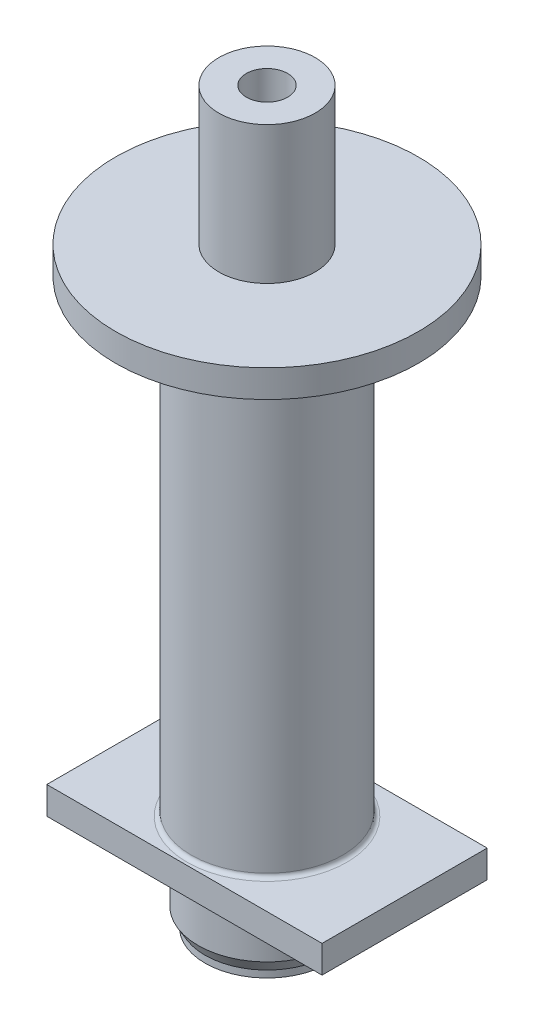
ISO-10303-21;
HEADER;
FILE_DESCRIPTION(('STEP AP214'),'2;1');
FILE_NAME('part.step','',(''),(''),'','','');
FILE_SCHEMA(('AUTOMOTIVE_DESIGN { 1 0 10303 214 1 1 1 1 }'));
ENDSEC;
DATA;
#1=APPLICATION_CONTEXT('core data for automotive mechanical design processes');
#2=APPLICATION_PROTOCOL_DEFINITION('international standard','automotive_design',2000,#1);
#3=PRODUCT_CONTEXT('',#1,'mechanical');
#4=PRODUCT('Part','Part','',(#3));
#5=PRODUCT_RELATED_PRODUCT_CATEGORY('part','',(#4));
#6=PRODUCT_DEFINITION_FORMATION('','',#4);
#7=PRODUCT_DEFINITION_CONTEXT('part definition',#1,'design');
#8=PRODUCT_DEFINITION('design','',#6,#7);
#9=PRODUCT_DEFINITION_SHAPE('','',#8);
#10=(LENGTH_UNIT() NAMED_UNIT(*) SI_UNIT(.MILLI.,.METRE.));
#11=(NAMED_UNIT(*) PLANE_ANGLE_UNIT() SI_UNIT($,.RADIAN.));
#12=(NAMED_UNIT(*) SI_UNIT($,.STERADIAN.) SOLID_ANGLE_UNIT());
#13=UNCERTAINTY_MEASURE_WITH_UNIT(LENGTH_MEASURE(1.E-05),#10,'distance_accuracy_value','');
#14=(GEOMETRIC_REPRESENTATION_CONTEXT(3) GLOBAL_UNCERTAINTY_ASSIGNED_CONTEXT((#13)) GLOBAL_UNIT_ASSIGNED_CONTEXT((#10,
#11,#12)) REPRESENTATION_CONTEXT('',''));
#15=CARTESIAN_POINT('',(0.,0.,0.));
#16=DIRECTION('',(0.,0.,1.));
#17=DIRECTION('',(1.,0.,0.));
#18=AXIS2_PLACEMENT_3D('',#15,#16,#17);
#19=CARTESIAN_POINT('',(-34.9999999999999,530.,0.));
#20=DIRECTION('',(0.,1.,0.));
#21=DIRECTION('',(0.,0.,1.));
#22=AXIS2_PLACEMENT_3D('',#19,#20,#21);
#23=PLANE('',#22);
#24=CARTESIAN_POINT('',(0.,530.,0.));
#25=DIRECTION('',(0.,1.,0.));
#26=DIRECTION('',(-1.,0.,0.));
#27=AXIS2_PLACEMENT_3D('',#24,#25,#26);
#28=CIRCLE('',#27,15.);
#29=CARTESIAN_POINT('',(-15.,530.,0.));
#30=VERTEX_POINT('',#29);
#31=EDGE_CURVE('E104',#30,#30,#28,.T.);
#32=ORIENTED_EDGE('',*,*,#31,.F.);
#33=EDGE_LOOP('',(#32));
#34=FACE_BOUND('',#33,.T.);
#35=CARTESIAN_POINT('',(0.,530.,0.));
#36=DIRECTION('',(0.,1.,0.));
#37=DIRECTION('',(0.,0.,1.));
#38=AXIS2_PLACEMENT_3D('',#35,#36,#37);
#39=CIRCLE('',#38,34.9999999999999);
#40=CARTESIAN_POINT('',(0.,530.,34.9999999999999));
#41=VERTEX_POINT('',#40);
#42=EDGE_CURVE('E141',#41,#41,#39,.T.);
#43=ORIENTED_EDGE('',*,*,#42,.T.);
#44=EDGE_LOOP('',(#43));
#45=FACE_BOUND('',#44,.T.);
#46=ADVANCED_FACE('F33',(#34,#45),#23,.T.);
#47=CARTESIAN_POINT('',(0.,530.,0.));
#48=DIRECTION('',(0.,1.,0.));
#49=DIRECTION('',(0.,0.,1.));
#50=AXIS2_PLACEMENT_3D('',#47,#48,#49);
#51=CYLINDRICAL_SURFACE('',#50,34.9999999999999);
#52=CARTESIAN_POINT('',(0.,430.,0.));
#53=DIRECTION('',(0.,1.,0.));
#54=DIRECTION('',(0.,0.,1.));
#55=AXIS2_PLACEMENT_3D('',#52,#53,#54);
#56=CIRCLE('',#55,34.9999999999999);
#57=CARTESIAN_POINT('',(0.,430.,34.9999999999999));
#58=VERTEX_POINT('',#57);
#59=EDGE_CURVE('E138',#58,#58,#56,.T.);
#60=ORIENTED_EDGE('',*,*,#59,.T.);
#61=EDGE_LOOP('',(#60));
#62=FACE_BOUND('',#61,.T.);
#63=ORIENTED_EDGE('',*,*,#42,.F.);
#64=EDGE_LOOP('',(#63));
#65=FACE_BOUND('',#64,.T.);
#66=ADVANCED_FACE('F177',(#62,#65),#51,.T.);
#67=CARTESIAN_POINT('',(-110.,430.,0.));
#68=DIRECTION('',(0.,1.,0.));
#69=DIRECTION('',(0.,0.,1.));
#70=AXIS2_PLACEMENT_3D('',#67,#68,#69);
#71=PLANE('',#70);
#72=CARTESIAN_POINT('',(0.,430.,0.));
#73=DIRECTION('',(0.,1.,0.));
#74=DIRECTION('',(0.,0.,1.));
#75=AXIS2_PLACEMENT_3D('',#72,#73,#74);
#76=CIRCLE('',#75,110.);
#77=CARTESIAN_POINT('',(0.,430.,110.));
#78=VERTEX_POINT('',#77);
#79=EDGE_CURVE('E135',#78,#78,#76,.T.);
#80=ORIENTED_EDGE('',*,*,#79,.T.);
#81=EDGE_LOOP('',(#80));
#82=FACE_BOUND('',#81,.T.);
#83=ORIENTED_EDGE('',*,*,#59,.F.);
#84=EDGE_LOOP('',(#83));
#85=FACE_BOUND('',#84,.T.);
#86=ADVANCED_FACE('F182',(#82,#85),#71,.T.);
#87=CARTESIAN_POINT('',(0.,530.,0.));
#88=DIRECTION('',(0.,1.,0.));
#89=DIRECTION('',(0.,0.,1.));
#90=AXIS2_PLACEMENT_3D('',#87,#88,#89);
#91=CYLINDRICAL_SURFACE('',#90,110.);
#92=CARTESIAN_POINT('',(0.,410.,0.));
#93=DIRECTION('',(0.,1.,0.));
#94=DIRECTION('',(0.,0.,1.));
#95=AXIS2_PLACEMENT_3D('',#92,#93,#94);
#96=CIRCLE('',#95,110.);
#97=CARTESIAN_POINT('',(0.,410.,110.));
#98=VERTEX_POINT('',#97);
#99=EDGE_CURVE('E132',#98,#98,#96,.T.);
#100=ORIENTED_EDGE('',*,*,#99,.T.);
#101=EDGE_LOOP('',(#100));
#102=FACE_BOUND('',#101,.T.);
#103=ORIENTED_EDGE('',*,*,#79,.F.);
#104=EDGE_LOOP('',(#103));
#105=FACE_BOUND('',#104,.T.);
#106=ADVANCED_FACE('F190',(#102,#105),#91,.T.);
#107=CARTESIAN_POINT('',(-54.9999999999999,410.,0.));
#108=DIRECTION('',(0.,-1.,0.));
#109=DIRECTION('',(0.,0.,-1.));
#110=AXIS2_PLACEMENT_3D('',#107,#108,#109);
#111=PLANE('',#110);
#112=CARTESIAN_POINT('',(0.,410.,0.));
#113=DIRECTION('',(0.,1.,0.));
#114=DIRECTION('',(0.,0.,1.));
#115=AXIS2_PLACEMENT_3D('',#112,#113,#114);
#116=CIRCLE('',#115,54.9999999999999);
#117=CARTESIAN_POINT('',(0.,410.,54.9999999999999));
#118=VERTEX_POINT('',#117);
#119=EDGE_CURVE('E129',#118,#118,#116,.T.);
#120=ORIENTED_EDGE('',*,*,#119,.T.);
#121=EDGE_LOOP('',(#120));
#122=FACE_BOUND('',#121,.T.);
#123=ORIENTED_EDGE('',*,*,#99,.F.);
#124=EDGE_LOOP('',(#123));
#125=FACE_BOUND('',#124,.T.);
#126=ADVANCED_FACE('F194',(#122,#125),#111,.T.);
#127=CARTESIAN_POINT('',(0.,530.,0.));
#128=DIRECTION('',(0.,1.,0.));
#129=DIRECTION('',(0.,0.,1.));
#130=AXIS2_PLACEMENT_3D('',#127,#128,#129);
#131=CYLINDRICAL_SURFACE('',#130,55.);
#132=CARTESIAN_POINT('',(0.,73.,0.));
#133=DIRECTION('',(0.,1.,0.));
#134=DIRECTION('',(0.,0.,1.));
#135=AXIS2_PLACEMENT_3D('',#132,#133,#134);
#136=CIRCLE('',#135,55.);
#137=CARTESIAN_POINT('',(0.,73.,55.));
#138=VERTEX_POINT('',#137);
#139=EDGE_CURVE('E144',#138,#138,#136,.T.);
#140=ORIENTED_EDGE('',*,*,#139,.T.);
#141=EDGE_LOOP('',(#140));
#142=FACE_BOUND('',#141,.T.);
#143=ORIENTED_EDGE('',*,*,#119,.F.);
#144=EDGE_LOOP('',(#143));
#145=FACE_BOUND('',#144,.T.);
#146=ADVANCED_FACE('F198',(#142,#145),#131,.T.);
#147=CARTESIAN_POINT('',(-60.,70.,0.));
#148=DIRECTION('',(0.,1.,0.));
#149=DIRECTION('',(0.,0.,1.));
#150=AXIS2_PLACEMENT_3D('',#147,#148,#149);
#151=PLANE('',#150);
#152=CARTESIAN_POINT('',(0.,70.,0.));
#153=DIRECTION('',(0.,1.,0.));
#154=DIRECTION('',(0.,0.,1.));
#155=AXIS2_PLACEMENT_3D('',#152,#153,#154);
#156=CIRCLE('',#155,58.);
#157=CARTESIAN_POINT('',(0.,70.,58.));
#158=VERTEX_POINT('',#157);
#159=EDGE_CURVE('E43',#158,#158,#156,.F.);
#160=ORIENTED_EDGE('',*,*,#159,.T.);
#161=EDGE_LOOP('',(#160));
#162=FACE_BOUND('',#161,.T.);
#163=DIRECTION('',(0.,0.,-1.));
#164=VECTOR('',#163,1.);
#165=CARTESIAN_POINT('',(100.,70.,60.));
#166=LINE('',#165,#164);
#167=CARTESIAN_POINT('',(100.,70.,60.));
#168=VERTEX_POINT('',#167);
#169=CARTESIAN_POINT('',(100.,70.,-60.));
#170=VERTEX_POINT('',#169);
#171=EDGE_CURVE('E87',#168,#170,#166,.T.);
#172=ORIENTED_EDGE('',*,*,#171,.T.);
#173=DIRECTION('',(-1.,0.,0.));
#174=VECTOR('',#173,1.);
#175=CARTESIAN_POINT('',(100.,70.,-60.));
#176=LINE('',#175,#174);
#177=CARTESIAN_POINT('',(-100.,70.,-59.9999999999999));
#178=VERTEX_POINT('',#177);
#179=EDGE_CURVE('E82',#170,#178,#176,.T.);
#180=ORIENTED_EDGE('',*,*,#179,.T.);
#181=DIRECTION('',(0.,0.,1.));
#182=VECTOR('',#181,1.);
#183=CARTESIAN_POINT('',(-100.,70.,-59.9999999999999));
#184=LINE('',#183,#182);
#185=CARTESIAN_POINT('',(-100.,70.,60.));
#186=VERTEX_POINT('',#185);
#187=EDGE_CURVE('E51',#178,#186,#184,.T.);
#188=ORIENTED_EDGE('',*,*,#187,.T.);
#189=DIRECTION('',(1.,0.,0.));
#190=VECTOR('',#189,1.);
#191=CARTESIAN_POINT('',(-100.,70.,60.));
#192=LINE('',#191,#190);
#193=EDGE_CURVE('E79',#186,#168,#192,.T.);
#194=ORIENTED_EDGE('',*,*,#193,.T.);
#195=EDGE_LOOP('',(#172,#180,#188,#194));
#196=FACE_BOUND('',#195,.T.);
#197=ADVANCED_FACE('F90',(#162,#196),#151,.T.);
#198=CARTESIAN_POINT('',(0.,73.,0.));
#199=DIRECTION('',(0.,1.,0.));
#200=DIRECTION('',(0.,0.,1.));
#201=AXIS2_PLACEMENT_3D('',#198,#199,#200);
#202=TOROIDAL_SURFACE('',#201,58.,3.);
#203=ORIENTED_EDGE('',*,*,#159,.F.);
#204=EDGE_LOOP('',(#203));
#205=FACE_BOUND('',#204,.T.);
#206=ORIENTED_EDGE('',*,*,#139,.F.);
#207=EDGE_LOOP('',(#206));
#208=FACE_BOUND('',#207,.T.);
#209=ADVANCED_FACE('F35',(#205,#208),#202,.F.);
#210=CARTESIAN_POINT('',(0.,410.,0.));
#211=DIRECTION('',(0.,-1.,0.));
#212=DIRECTION('',(0.,0.,-1.));
#213=AXIS2_PLACEMENT_3D('',#210,#211,#212);
#214=CYLINDRICAL_SURFACE('',#213,25.);
#215=CARTESIAN_POINT('',(0.,70.,0.));
#216=DIRECTION('',(0.,1.,0.));
#217=DIRECTION('',(0.,0.,1.));
#218=AXIS2_PLACEMENT_3D('',#215,#216,#217);
#219=CIRCLE('',#218,25.);
#220=CARTESIAN_POINT('',(0.,70.,-25.));
#221=VERTEX_POINT('',#220);
#222=EDGE_CURVE('E37',#221,#221,#219,.F.);
#223=CARTESIAN_POINT('',(0.,410.,0.));
#224=DIRECTION('',(0.,-1.,0.));
#225=DIRECTION('',(0.,0.,-1.));
#226=AXIS2_PLACEMENT_3D('',#223,#224,#225);
#227=CIRCLE('',#226,25.);
#228=CARTESIAN_POINT('',(0.,410.,-25.));
#229=VERTEX_POINT('',#228);
#230=EDGE_CURVE('E108',#229,#229,#227,.T.);
#231=CARTESIAN_POINT('',(0.,70.,-25.));
#232=CARTESIAN_POINT('',(0.,73.5416666666666,-25.));
#233=CARTESIAN_POINT('',(0.,77.0833333333333,-25.));
#234=CARTESIAN_POINT('',(0.,84.1666666666666,-25.));
#235=CARTESIAN_POINT('',(0.,87.7083333333333,-25.));
#236=CARTESIAN_POINT('',(0.,94.7916666666666,-25.));
#237=CARTESIAN_POINT('',(0.,98.3333333333333,-25.));
#238=CARTESIAN_POINT('',(0.,105.416666666667,-25.));
#239=CARTESIAN_POINT('',(0.,108.958333333333,-25.));
#240=CARTESIAN_POINT('',(0.,116.041666666667,-25.));
#241=CARTESIAN_POINT('',(0.,119.583333333333,-25.));
#242=CARTESIAN_POINT('',(0.,126.666666666667,-25.));
#243=CARTESIAN_POINT('',(0.,130.208333333333,-25.));
#244=CARTESIAN_POINT('',(0.,137.291666666667,-25.));
#245=CARTESIAN_POINT('',(0.,140.833333333333,-25.));
#246=CARTESIAN_POINT('',(0.,147.916666666667,-25.));
#247=CARTESIAN_POINT('',(0.,151.458333333333,-25.));
#248=CARTESIAN_POINT('',(0.,158.541666666667,-25.));
#249=CARTESIAN_POINT('',(0.,162.083333333333,-25.));
#250=CARTESIAN_POINT('',(0.,169.166666666667,-25.));
#251=CARTESIAN_POINT('',(0.,172.708333333333,-25.));
#252=CARTESIAN_POINT('',(0.,179.791666666667,-25.));
#253=CARTESIAN_POINT('',(0.,183.333333333333,-25.));
#254=CARTESIAN_POINT('',(0.,190.416666666667,-25.));
#255=CARTESIAN_POINT('',(0.,193.958333333333,-25.));
#256=CARTESIAN_POINT('',(0.,201.041666666667,-25.));
#257=CARTESIAN_POINT('',(0.,204.583333333333,-25.));
#258=CARTESIAN_POINT('',(0.,211.666666666667,-25.));
#259=CARTESIAN_POINT('',(0.,215.208333333333,-25.));
#260=CARTESIAN_POINT('',(0.,222.291666666667,-25.));
#261=CARTESIAN_POINT('',(0.,225.833333333333,-25.));
#262=CARTESIAN_POINT('',(0.,232.916666666667,-25.));
#263=CARTESIAN_POINT('',(0.,236.458333333333,-25.));
#264=CARTESIAN_POINT('',(0.,243.541666666667,-25.));
#265=CARTESIAN_POINT('',(0.,247.083333333333,-25.));
#266=CARTESIAN_POINT('',(0.,254.166666666667,-25.));
#267=CARTESIAN_POINT('',(0.,257.708333333333,-25.));
#268=CARTESIAN_POINT('',(0.,264.791666666667,-25.));
#269=CARTESIAN_POINT('',(0.,268.333333333333,-25.));
#270=CARTESIAN_POINT('',(0.,275.416666666667,-25.));
#271=CARTESIAN_POINT('',(0.,278.958333333333,-25.));
#272=CARTESIAN_POINT('',(0.,286.041666666667,-25.));
#273=CARTESIAN_POINT('',(0.,289.583333333333,-25.));
#274=CARTESIAN_POINT('',(0.,296.666666666667,-25.));
#275=CARTESIAN_POINT('',(0.,300.208333333333,-25.));
#276=CARTESIAN_POINT('',(0.,307.291666666667,-25.));
#277=CARTESIAN_POINT('',(0.,310.833333333333,-25.));
#278=CARTESIAN_POINT('',(0.,317.916666666667,-25.));
#279=CARTESIAN_POINT('',(0.,321.458333333333,-25.));
#280=CARTESIAN_POINT('',(0.,328.541666666667,-25.));
#281=CARTESIAN_POINT('',(0.,332.083333333333,-25.));
#282=CARTESIAN_POINT('',(0.,339.166666666667,-25.));
#283=CARTESIAN_POINT('',(0.,342.708333333333,-25.));
#284=CARTESIAN_POINT('',(0.,349.791666666667,-25.));
#285=CARTESIAN_POINT('',(0.,353.333333333333,-25.));
#286=CARTESIAN_POINT('',(0.,360.416666666667,-25.));
#287=CARTESIAN_POINT('',(0.,363.958333333333,-25.));
#288=CARTESIAN_POINT('',(0.,371.041666666667,-25.));
#289=CARTESIAN_POINT('',(0.,374.583333333333,-25.));
#290=CARTESIAN_POINT('',(0.,381.666666666667,-25.));
#291=CARTESIAN_POINT('',(0.,385.208333333333,-25.));
#292=CARTESIAN_POINT('',(0.,392.291666666667,-25.));
#293=CARTESIAN_POINT('',(0.,395.833333333333,-25.));
#294=CARTESIAN_POINT('',(0.,402.916666666667,-25.));
#295=CARTESIAN_POINT('',(0.,406.458333333333,-25.));
#296=CARTESIAN_POINT('',(0.,410.,-25.));
#297=B_SPLINE_CURVE_WITH_KNOTS('',3,(#231,#232,#233,#234,#235,#236,#237,#238,#239,#240,#241,
#242,#243,#244,#245,#246,#247,#248,#249,#250,#251,#252,#253,#254,#255,#256,#257,#258,#259,#260,
#261,#262,#263,#264,#265,#266,#267,#268,#269,#270,#271,#272,#273,#274,#275,#276,#277,#278,#279,
#280,#281,#282,#283,#284,#285,#286,#287,#288,#289,#290,#291,#292,#293,#294,#295,#296),
.UNSPECIFIED.,.F.,.F.,(4,2,2,2,2,2,2,2,2,2,2,2,2,2,2,2,2,2,2,2,2,2,2,2,2,2,2,2,2,2,2,2,4),(0.,
10.625,21.25,31.875,42.5,53.125,63.75,74.375,85.,95.625,106.25,116.875,127.5,138.125,148.75,
159.375,170.,180.625,191.25,201.875,212.5,223.125,233.75,244.375,255.,265.625,276.25,286.875,
297.5,308.125,318.75,329.375,340.),.UNSPECIFIED.);
#298=EDGE_CURVE('BSEAM158',#221,#229,#297,.T.);
#299=ORIENTED_EDGE('',*,*,#222,.T.);
#300=ORIENTED_EDGE('',*,*,#230,.F.);
#301=ORIENTED_EDGE('',*,*,#298,.T.);
#302=ORIENTED_EDGE('',*,*,#298,.F.);
#303=EDGE_LOOP('',(#299,#301,#300,#302));
#304=FACE_BOUND('',#303,.T.);
#305=ADVANCED_FACE('F158',(#304),#214,.F.);
#306=CARTESIAN_POINT('',(0.,410.,0.));
#307=DIRECTION('',(0.,-1.,0.));
#308=DIRECTION('',(0.,0.,-1.));
#309=AXIS2_PLACEMENT_3D('',#306,#307,#308);
#310=PLANE('',#309);
#311=CARTESIAN_POINT('',(0.,410.,0.));
#312=DIRECTION('',(0.,-1.,0.));
#313=DIRECTION('',(0.,0.,-1.));
#314=AXIS2_PLACEMENT_3D('',#311,#312,#313);
#315=CIRCLE('',#314,15.);
#316=CARTESIAN_POINT('',(0.,410.,-15.));
#317=VERTEX_POINT('',#316);
#318=EDGE_CURVE('E107',#317,#317,#315,.T.);
#319=ORIENTED_EDGE('',*,*,#318,.F.);
#320=EDGE_LOOP('',(#319));
#321=FACE_BOUND('',#320,.T.);
#322=ORIENTED_EDGE('',*,*,#230,.T.);
#323=EDGE_LOOP('',(#322));
#324=FACE_BOUND('',#323,.T.);
#325=ADVANCED_FACE('F155',(#321,#324),#310,.T.);
#326=CARTESIAN_POINT('',(0.,380.,0.));
#327=DIRECTION('',(0.,1.,0.));
#328=DIRECTION('',(-1.,0.,0.));
#329=AXIS2_PLACEMENT_3D('',#326,#327,#328);
#330=CYLINDRICAL_SURFACE('',#329,15.);
#331=ORIENTED_EDGE('',*,*,#318,.T.);
#332=EDGE_LOOP('',(#331));
#333=FACE_BOUND('',#332,.T.);
#334=ORIENTED_EDGE('',*,*,#31,.T.);
#335=EDGE_LOOP('',(#334));
#336=FACE_BOUND('',#335,.T.);
#337=ADVANCED_FACE('F152',(#333,#336),#330,.F.);
#338=CARTESIAN_POINT('',(0.,70.,0.));
#339=DIRECTION('',(0.,1.,0.));
#340=DIRECTION('',(0.,0.,1.));
#341=AXIS2_PLACEMENT_3D('',#338,#339,#340);
#342=PLANE('',#341);
#343=ORIENTED_EDGE('',*,*,#222,.F.);
#344=EDGE_LOOP('',(#343));
#345=FACE_BOUND('',#344,.T.);
#346=ADVANCED_FACE('F250',(#345),#342,.T.);
#347=CARTESIAN_POINT('',(0.,70.,60.));
#348=DIRECTION('',(0.,0.,-1.));
#349=DIRECTION('',(-1.,0.,0.));
#350=AXIS2_PLACEMENT_3D('',#347,#348,#349);
#351=PLANE('',#350);
#352=DIRECTION('',(0.,-1.,0.));
#353=VECTOR('',#352,1.);
#354=CARTESIAN_POINT('',(100.,70.,60.));
#355=LINE('',#354,#353);
#356=CARTESIAN_POINT('',(100.,50.,60.));
#357=VERTEX_POINT('',#356);
#358=EDGE_CURVE('E97',#168,#357,#355,.T.);
#359=ORIENTED_EDGE('',*,*,#358,.F.);
#360=ORIENTED_EDGE('',*,*,#193,.F.);
#361=DIRECTION('',(0.,-1.,0.));
#362=VECTOR('',#361,1.);
#363=CARTESIAN_POINT('',(-100.,70.,60.));
#364=LINE('',#363,#362);
#365=CARTESIAN_POINT('',(-100.,50.,60.));
#366=VERTEX_POINT('',#365);
#367=EDGE_CURVE('E100',#186,#366,#364,.T.);
#368=ORIENTED_EDGE('',*,*,#367,.T.);
#369=DIRECTION('',(1.,0.,0.));
#370=VECTOR('',#369,1.);
#371=CARTESIAN_POINT('',(0.,50.,60.));
#372=LINE('',#371,#370);
#373=EDGE_CURVE('E74',#366,#357,#372,.T.);
#374=ORIENTED_EDGE('',*,*,#373,.T.);
#375=EDGE_LOOP('',(#359,#360,#368,#374));
#376=FACE_BOUND('',#375,.T.);
#377=ADVANCED_FACE('F256',(#376),#351,.F.);
#378=CARTESIAN_POINT('',(100.,70.,-60.));
#379=DIRECTION('',(0.,0.,1.));
#380=DIRECTION('',(1.,0.,0.));
#381=AXIS2_PLACEMENT_3D('',#378,#379,#380);
#382=PLANE('',#381);
#383=ORIENTED_EDGE('',*,*,#179,.F.);
#384=DIRECTION('',(0.,-1.,0.));
#385=VECTOR('',#384,1.);
#386=CARTESIAN_POINT('',(100.,70.,-60.));
#387=LINE('',#386,#385);
#388=CARTESIAN_POINT('',(100.,50.,-60.));
#389=VERTEX_POINT('',#388);
#390=EDGE_CURVE('E85',#170,#389,#387,.T.);
#391=ORIENTED_EDGE('',*,*,#390,.T.);
#392=DIRECTION('',(-1.,0.,0.));
#393=VECTOR('',#392,1.);
#394=CARTESIAN_POINT('',(100.,50.,-60.));
#395=LINE('',#394,#393);
#396=CARTESIAN_POINT('',(-100.,50.,-59.9999999999999));
#397=VERTEX_POINT('',#396);
#398=EDGE_CURVE('E67',#389,#397,#395,.T.);
#399=ORIENTED_EDGE('',*,*,#398,.T.);
#400=DIRECTION('',(0.,-1.,0.));
#401=VECTOR('',#400,1.);
#402=CARTESIAN_POINT('',(-100.,70.,-59.9999999999999));
#403=LINE('',#402,#401);
#404=EDGE_CURVE('E86',#178,#397,#403,.T.);
#405=ORIENTED_EDGE('',*,*,#404,.F.);
#406=EDGE_LOOP('',(#383,#391,#399,#405));
#407=FACE_BOUND('',#406,.T.);
#408=ADVANCED_FACE('F83',(#407),#382,.F.);
#409=CARTESIAN_POINT('',(100.,70.,60.));
#410=DIRECTION('',(-1.,0.,0.));
#411=DIRECTION('',(0.,0.,1.));
#412=AXIS2_PLACEMENT_3D('',#409,#410,#411);
#413=PLANE('',#412);
#414=DIRECTION('',(0.,0.,-1.));
#415=VECTOR('',#414,1.);
#416=CARTESIAN_POINT('',(100.,50.,60.));
#417=LINE('',#416,#415);
#418=EDGE_CURVE('E96',#357,#389,#417,.T.);
#419=ORIENTED_EDGE('',*,*,#418,.T.);
#420=ORIENTED_EDGE('',*,*,#390,.F.);
#421=ORIENTED_EDGE('',*,*,#171,.F.);
#422=ORIENTED_EDGE('',*,*,#358,.T.);
#423=EDGE_LOOP('',(#419,#420,#421,#422));
#424=FACE_BOUND('',#423,.T.);
#425=ADVANCED_FACE('F95',(#424),#413,.F.);
#426=CARTESIAN_POINT('',(-100.,70.,-59.9999999999999));
#427=DIRECTION('',(1.,0.,0.));
#428=DIRECTION('',(0.,0.,-1.));
#429=AXIS2_PLACEMENT_3D('',#426,#427,#428);
#430=PLANE('',#429);
#431=DIRECTION('',(0.,0.,1.));
#432=VECTOR('',#431,1.);
#433=CARTESIAN_POINT('',(-100.,50.,-59.9999999999999));
#434=LINE('',#433,#432);
#435=EDGE_CURVE('E413',#397,#366,#434,.T.);
#436=ORIENTED_EDGE('',*,*,#435,.T.);
#437=ORIENTED_EDGE('',*,*,#367,.F.);
#438=ORIENTED_EDGE('',*,*,#187,.F.);
#439=ORIENTED_EDGE('',*,*,#404,.T.);
#440=EDGE_LOOP('',(#436,#437,#438,#439));
#441=FACE_BOUND('',#440,.T.);
#442=ADVANCED_FACE('F218',(#441),#430,.F.);
#443=CARTESIAN_POINT('',(0.,530.,0.));
#444=DIRECTION('',(0.,1.,0.));
#445=DIRECTION('',(0.,0.,1.));
#446=AXIS2_PLACEMENT_3D('',#443,#444,#445);
#447=CYLINDRICAL_SURFACE('',#446,50.);
#448=CARTESIAN_POINT('',(0.,13.6602540378442,0.));
#449=DIRECTION('',(0.,1.,0.));
#450=DIRECTION('',(0.,0.,1.));
#451=AXIS2_PLACEMENT_3D('',#448,#449,#450);
#452=CIRCLE('',#451,50.);
#453=CARTESIAN_POINT('',(0.,13.6602540378442,50.));
#454=VERTEX_POINT('',#453);
#455=EDGE_CURVE('E120',#454,#454,#452,.T.);
#456=ORIENTED_EDGE('',*,*,#455,.T.);
#457=EDGE_LOOP('',(#456));
#458=FACE_BOUND('',#457,.T.);
#459=CARTESIAN_POINT('',(0.,45.,0.));
#460=DIRECTION('',(0.,1.,0.));
#461=DIRECTION('',(0.,0.,1.));
#462=AXIS2_PLACEMENT_3D('',#459,#460,#461);
#463=CIRCLE('',#462,49.9999999999999);
#464=CARTESIAN_POINT('',(0.,45.,49.9999999999999));
#465=VERTEX_POINT('',#464);
#466=EDGE_CURVE('E123',#465,#465,#463,.T.);
#467=ORIENTED_EDGE('',*,*,#466,.F.);
#468=EDGE_LOOP('',(#467));
#469=FACE_BOUND('',#468,.T.);
#470=ADVANCED_FACE('F214',(#458,#469),#447,.T.);
#471=CARTESIAN_POINT('',(0.,45.,0.));
#472=DIRECTION('',(0.,1.,0.));
#473=DIRECTION('',(0.,0.,1.));
#474=AXIS2_PLACEMENT_3D('',#471,#472,#473);
#475=TOROIDAL_SURFACE('',#474,54.9999999999999,5.);
#476=ORIENTED_EDGE('',*,*,#466,.T.);
#477=EDGE_LOOP('',(#476));
#478=FACE_BOUND('',#477,.T.);
#479=CARTESIAN_POINT('',(0.,50.,0.));
#480=DIRECTION('',(0.,1.,0.));
#481=DIRECTION('',(0.,0.,1.));
#482=AXIS2_PLACEMENT_3D('',#479,#480,#481);
#483=CIRCLE('',#482,54.9999999999999);
#484=CARTESIAN_POINT('',(0.,50.,54.9999999999999));
#485=VERTEX_POINT('',#484);
#486=EDGE_CURVE('E126',#485,#485,#483,.T.);
#487=ORIENTED_EDGE('',*,*,#486,.F.);
#488=EDGE_LOOP('',(#487));
#489=FACE_BOUND('',#488,.T.);
#490=ADVANCED_FACE('F210',(#478,#489),#475,.F.);
#491=CARTESIAN_POINT('',(-54.9999999999999,50.,0.));
#492=DIRECTION('',(0.,-1.,0.));
#493=DIRECTION('',(0.,0.,-1.));
#494=AXIS2_PLACEMENT_3D('',#491,#492,#493);
#495=PLANE('',#494);
#496=ORIENTED_EDGE('',*,*,#486,.T.);
#497=EDGE_LOOP('',(#496));
#498=FACE_BOUND('',#497,.T.);
#499=ORIENTED_EDGE('',*,*,#373,.F.);
#500=ORIENTED_EDGE('',*,*,#435,.F.);
#501=ORIENTED_EDGE('',*,*,#398,.F.);
#502=ORIENTED_EDGE('',*,*,#418,.F.);
#503=EDGE_LOOP('',(#499,#500,#501,#502));
#504=FACE_BOUND('',#503,.T.);
#505=ADVANCED_FACE('F206',(#498,#504),#495,.T.);
#506=CARTESIAN_POINT('',(0.,13.6602540378442,0.));
#507=DIRECTION('',(0.,1.,0.));
#508=DIRECTION('',(0.,0.,1.));
#509=AXIS2_PLACEMENT_3D('',#506,#507,#508);
#510=CONICAL_SURFACE('',#509,50.,0.523598775598303);
#511=CARTESIAN_POINT('',(0.,5.,0.));
#512=DIRECTION('',(0.,1.,0.));
#513=DIRECTION('',(0.,0.,1.));
#514=AXIS2_PLACEMENT_3D('',#511,#512,#513);
#515=CIRCLE('',#514,45.);
#516=CARTESIAN_POINT('',(0.,5.,45.));
#517=VERTEX_POINT('',#516);
#518=EDGE_CURVE('E117',#517,#517,#515,.T.);
#519=ORIENTED_EDGE('',*,*,#518,.T.);
#520=EDGE_LOOP('',(#519));
#521=FACE_BOUND('',#520,.T.);
#522=ORIENTED_EDGE('',*,*,#455,.F.);
#523=EDGE_LOOP('',(#522));
#524=FACE_BOUND('',#523,.T.);
#525=ADVANCED_FACE('F209',(#521,#524),#510,.T.);
#526=CARTESIAN_POINT('',(0.,530.,0.));
#527=DIRECTION('',(0.,1.,0.));
#528=DIRECTION('',(0.,0.,1.));
#529=AXIS2_PLACEMENT_3D('',#526,#527,#528);
#530=CYLINDRICAL_SURFACE('',#529,45.);
#531=CARTESIAN_POINT('',(0.,0.,0.));
#532=DIRECTION('',(0.,1.,0.));
#533=DIRECTION('',(0.,0.,1.));
#534=AXIS2_PLACEMENT_3D('',#531,#532,#533);
#535=CIRCLE('',#534,45.);
#536=CARTESIAN_POINT('',(0.,0.,45.));
#537=VERTEX_POINT('',#536);
#538=EDGE_CURVE('E111',#537,#537,#535,.T.);
#539=ORIENTED_EDGE('',*,*,#538,.T.);
#540=EDGE_LOOP('',(#539));
#541=FACE_BOUND('',#540,.T.);
#542=ORIENTED_EDGE('',*,*,#518,.F.);
#543=EDGE_LOOP('',(#542));
#544=FACE_BOUND('',#543,.T.);
#545=ADVANCED_FACE('F222',(#541,#544),#530,.T.);
#546=CARTESIAN_POINT('',(0.,0.,0.));
#547=DIRECTION('',(0.,-1.,0.));
#548=DIRECTION('',(0.,0.,-1.));
#549=AXIS2_PLACEMENT_3D('',#546,#547,#548);
#550=PLANE('',#549);
#551=CARTESIAN_POINT('',(0.,0.,0.));
#552=DIRECTION('',(0.,-1.,0.));
#553=DIRECTION('',(0.,0.,-1.));
#554=AXIS2_PLACEMENT_3D('',#551,#552,#553);
#555=CIRCLE('',#554,25.);
#556=CARTESIAN_POINT('',(0.,0.,-25.));
#557=VERTEX_POINT('',#556);
#558=EDGE_CURVE('E112',#557,#557,#555,.T.);
#559=ORIENTED_EDGE('',*,*,#558,.F.);
#560=EDGE_LOOP('',(#559));
#561=FACE_BOUND('',#560,.T.);
#562=ORIENTED_EDGE('',*,*,#538,.F.);
#563=EDGE_LOOP('',(#562));
#564=FACE_BOUND('',#563,.T.);
#565=ADVANCED_FACE('F174',(#561,#564),#550,.T.);
#566=CARTESIAN_POINT('',(0.,50.,0.));
#567=DIRECTION('',(0.,1.,0.));
#568=DIRECTION('',(0.,0.,1.));
#569=AXIS2_PLACEMENT_3D('',#566,#567,#568);
#570=CIRCLE('',#569,25.);
#571=CARTESIAN_POINT('',(0.,49.9999999999999,-25.));
#572=VERTEX_POINT('',#571);
#573=EDGE_CURVE('E11',#572,#572,#570,.F.);
#574=CARTESIAN_POINT('',(0.,0.,-25.));
#575=CARTESIAN_POINT('',(0.,0.520833333333341,-25.));
#576=CARTESIAN_POINT('',(0.,1.04166666666668,-25.));
#577=CARTESIAN_POINT('',(0.,2.08333333333334,-25.));
#578=CARTESIAN_POINT('',(0.,2.60416666666667,-25.));
#579=CARTESIAN_POINT('',(0.,3.64583333333333,-25.));
#580=CARTESIAN_POINT('',(0.,4.16666666666667,-25.));
#581=CARTESIAN_POINT('',(0.,5.20833333333333,-25.));
#582=CARTESIAN_POINT('',(0.,5.72916666666666,-25.));
#583=CARTESIAN_POINT('',(0.,6.77083333333332,-25.));
#584=CARTESIAN_POINT('',(0.,7.29166666666666,-25.));
#585=CARTESIAN_POINT('',(0.,8.33333333333332,-25.));
#586=CARTESIAN_POINT('',(0.,8.85416666666664,-25.));
#587=CARTESIAN_POINT('',(0.,9.89583333333331,-25.));
#588=CARTESIAN_POINT('',(0.,10.4166666666666,-25.));
#589=CARTESIAN_POINT('',(0.,11.4583333333333,-25.));
#590=CARTESIAN_POINT('',(0.,11.9791666666666,-25.));
#591=CARTESIAN_POINT('',(0.,13.0208333333333,-25.));
#592=CARTESIAN_POINT('',(0.,13.5416666666666,-25.));
#593=CARTESIAN_POINT('',(0.,14.5833333333333,-25.));
#594=CARTESIAN_POINT('',(0.,15.1041666666667,-25.));
#595=CARTESIAN_POINT('',(0.,16.1458333333333,-25.));
#596=CARTESIAN_POINT('',(0.,16.6666666666666,-25.));
#597=CARTESIAN_POINT('',(0.,17.7083333333333,-25.));
#598=CARTESIAN_POINT('',(0.,18.2291666666666,-25.));
#599=CARTESIAN_POINT('',(0.,19.2708333333333,-25.));
#600=CARTESIAN_POINT('',(0.,19.7916666666666,-25.));
#601=CARTESIAN_POINT('',(0.,20.8333333333333,-25.));
#602=CARTESIAN_POINT('',(0.,21.3541666666666,-25.));
#603=CARTESIAN_POINT('',(0.,22.3958333333333,-25.));
#604=CARTESIAN_POINT('',(0.,22.9166666666666,-25.));
#605=CARTESIAN_POINT('',(0.,23.9583333333333,-25.));
#606=CARTESIAN_POINT('',(0.,24.4791666666666,-25.));
#607=CARTESIAN_POINT('',(0.,25.5208333333333,-25.));
#608=CARTESIAN_POINT('',(0.,26.0416666666666,-25.));
#609=CARTESIAN_POINT('',(0.,27.0833333333333,-25.));
#610=CARTESIAN_POINT('',(0.,27.6041666666666,-25.));
#611=CARTESIAN_POINT('',(0.,28.6458333333333,-25.));
#612=CARTESIAN_POINT('',(0.,29.1666666666666,-25.));
#613=CARTESIAN_POINT('',(0.,30.2083333333333,-25.));
#614=CARTESIAN_POINT('',(0.,30.7291666666666,-25.));
#615=CARTESIAN_POINT('',(0.,31.7708333333333,-25.));
#616=CARTESIAN_POINT('',(0.,32.2916666666666,-25.));
#617=CARTESIAN_POINT('',(0.,33.3333333333333,-25.));
#618=CARTESIAN_POINT('',(0.,33.8541666666666,-25.));
#619=CARTESIAN_POINT('',(0.,34.8958333333333,-25.));
#620=CARTESIAN_POINT('',(0.,35.4166666666666,-25.));
#621=CARTESIAN_POINT('',(0.,36.4583333333333,-25.));
#622=CARTESIAN_POINT('',(0.,36.9791666666666,-25.));
#623=CARTESIAN_POINT('',(0.,38.0208333333333,-25.));
#624=CARTESIAN_POINT('',(0.,38.5416666666666,-25.));
#625=CARTESIAN_POINT('',(0.,39.5833333333333,-25.));
#626=CARTESIAN_POINT('',(0.,40.1041666666666,-25.));
#627=CARTESIAN_POINT('',(0.,41.1458333333333,-25.));
#628=CARTESIAN_POINT('',(0.,41.6666666666666,-25.));
#629=CARTESIAN_POINT('',(0.,42.7083333333333,-25.));
#630=CARTESIAN_POINT('',(0.,43.2291666666666,-25.));
#631=CARTESIAN_POINT('',(0.,44.2708333333333,-25.));
#632=CARTESIAN_POINT('',(0.,44.7916666666666,-25.));
#633=CARTESIAN_POINT('',(0.,45.8333333333333,-25.));
#634=CARTESIAN_POINT('',(0.,46.3541666666666,-25.));
#635=CARTESIAN_POINT('',(0.,47.3958333333333,-25.));
#636=CARTESIAN_POINT('',(0.,47.9166666666666,-25.));
#637=CARTESIAN_POINT('',(0.,48.9583333333333,-25.));
#638=CARTESIAN_POINT('',(0.,49.4791666666666,-25.));
#639=CARTESIAN_POINT('',(0.,49.9999999999999,-25.));
#640=B_SPLINE_CURVE_WITH_KNOTS('',3,(#574,#575,#576,#577,#578,#579,#580,#581,#582,#583,#584,
#585,#586,#587,#588,#589,#590,#591,#592,#593,#594,#595,#596,#597,#598,#599,#600,#601,#602,#603,
#604,#605,#606,#607,#608,#609,#610,#611,#612,#613,#614,#615,#616,#617,#618,#619,#620,#621,#622,
#623,#624,#625,#626,#627,#628,#629,#630,#631,#632,#633,#634,#635,#636,#637,#638,#639),
.UNSPECIFIED.,.F.,.F.,(4,2,2,2,2,2,2,2,2,2,2,2,2,2,2,2,2,2,2,2,2,2,2,2,2,2,2,2,2,2,2,2,4),(0.,
1.56250000000002,3.12499999999999,4.68750000000001,6.24999999999998,7.8125,9.37499999999997,
10.9375,12.5,14.0625,15.625,17.1875,18.75,20.3125,21.875,23.4374999999999,25.,26.5625,28.125,
29.6875,31.2499999999999,32.8125,34.3749999999999,35.9375,37.5,39.0624999999999,40.625,
42.1874999999999,43.75,45.3124999999999,46.8749999999999,48.4374999999999,49.9999999999999),.UNSPECIFIED.);
#641=EDGE_CURVE('BSEAM165',#557,#572,#640,.T.);
#642=ORIENTED_EDGE('',*,*,#558,.T.);
#643=ORIENTED_EDGE('',*,*,#573,.F.);
#644=ORIENTED_EDGE('',*,*,#641,.T.);
#645=ORIENTED_EDGE('',*,*,#641,.F.);
#646=EDGE_LOOP('',(#642,#644,#643,#645));
#647=FACE_BOUND('',#646,.T.);
#648=ADVANCED_FACE('F165',(#647),#214,.F.);
#649=CARTESIAN_POINT('',(0.,50.,0.));
#650=DIRECTION('',(0.,1.,0.));
#651=DIRECTION('',(0.,0.,1.));
#652=AXIS2_PLACEMENT_3D('',#649,#650,#651);
#653=PLANE('',#652);
#654=ORIENTED_EDGE('',*,*,#573,.T.);
#655=EDGE_LOOP('',(#654));
#656=FACE_BOUND('',#655,.T.);
#657=ADVANCED_FACE('F173',(#656),#653,.F.);
#658=CLOSED_SHELL('',(#46,#66,#86,#106,#126,#146,#197,#209,#305,#325,#337,#346,#377,#408,#425,
#442,#470,#490,#505,#525,#545,#565,#648,#657));
#659=MANIFOLD_SOLID_BREP('B2',#658);
#660=ADVANCED_BREP_SHAPE_REPRESENTATION('',(#18,#659),#14);
#661=SHAPE_DEFINITION_REPRESENTATION(#9,#660);
ENDSEC;
END-ISO-10303-21;
